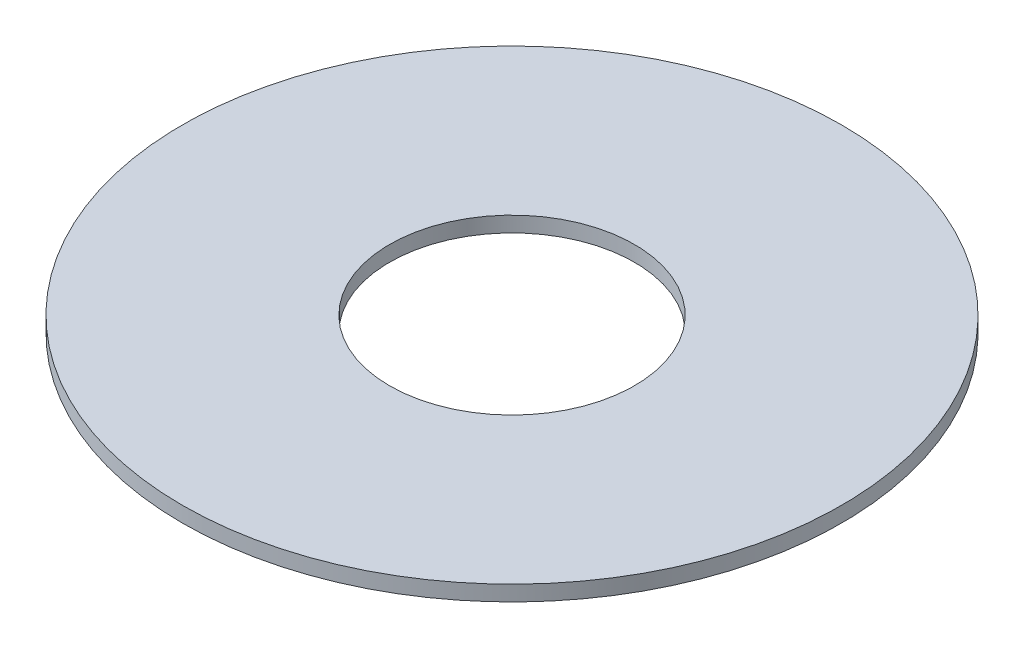
ISO-10303-21;
HEADER;
FILE_DESCRIPTION(('STEP AP214'),'2;1');
FILE_NAME('part.step','',(''),(''),'','','');
FILE_SCHEMA(('AUTOMOTIVE_DESIGN { 1 0 10303 214 1 1 1 1 }'));
ENDSEC;
DATA;
#1=APPLICATION_CONTEXT('core data for automotive mechanical design processes');
#2=APPLICATION_PROTOCOL_DEFINITION('international standard','automotive_design',2000,#1);
#3=PRODUCT_CONTEXT('',#1,'mechanical');
#4=PRODUCT('Part','Part','',(#3));
#5=PRODUCT_RELATED_PRODUCT_CATEGORY('part','',(#4));
#6=PRODUCT_DEFINITION_FORMATION('','',#4);
#7=PRODUCT_DEFINITION_CONTEXT('part definition',#1,'design');
#8=PRODUCT_DEFINITION('design','',#6,#7);
#9=PRODUCT_DEFINITION_SHAPE('','',#8);
#10=(LENGTH_UNIT() NAMED_UNIT(*) SI_UNIT(.MILLI.,.METRE.));
#11=(NAMED_UNIT(*) PLANE_ANGLE_UNIT() SI_UNIT($,.RADIAN.));
#12=(NAMED_UNIT(*) SI_UNIT($,.STERADIAN.) SOLID_ANGLE_UNIT());
#13=UNCERTAINTY_MEASURE_WITH_UNIT(LENGTH_MEASURE(1.E-05),#10,'distance_accuracy_value','');
#14=(GEOMETRIC_REPRESENTATION_CONTEXT(3) GLOBAL_UNCERTAINTY_ASSIGNED_CONTEXT((#13)) GLOBAL_UNIT_ASSIGNED_CONTEXT((#10,
#11,#12)) REPRESENTATION_CONTEXT('',''));
#15=CARTESIAN_POINT('',(0.,0.,0.));
#16=DIRECTION('',(0.,0.,1.));
#17=DIRECTION('',(1.,0.,0.));
#18=AXIS2_PLACEMENT_3D('',#15,#16,#17);
#19=CARTESIAN_POINT('',(0.,2.,0.));
#20=DIRECTION('',(0.,1.,0.));
#21=DIRECTION('',(0.,0.,1.));
#22=AXIS2_PLACEMENT_3D('',#19,#20,#21);
#23=PLANE('',#22);
#24=CARTESIAN_POINT('',(0.,2.,0.));
#25=DIRECTION('',(0.,1.,0.));
#26=DIRECTION('',(0.,0.,1.));
#27=AXIS2_PLACEMENT_3D('',#24,#25,#26);
#28=CIRCLE('',#27,42.725);
#29=CARTESIAN_POINT('',(0.,2.,42.725));
#30=VERTEX_POINT('',#29);
#31=EDGE_CURVE('E10',#30,#30,#28,.T.);
#32=ORIENTED_EDGE('',*,*,#31,.T.);
#33=EDGE_LOOP('',(#32));
#34=FACE_BOUND('',#33,.T.);
#35=CARTESIAN_POINT('',(0.,2.,0.));
#36=DIRECTION('',(0.,1.,0.));
#37=DIRECTION('',(0.,0.,1.));
#38=AXIS2_PLACEMENT_3D('',#35,#36,#37);
#39=CIRCLE('',#38,15.875);
#40=CARTESIAN_POINT('',(0.,2.,15.875));
#41=VERTEX_POINT('',#40);
#42=EDGE_CURVE('E41',#41,#41,#39,.T.);
#43=ORIENTED_EDGE('',*,*,#42,.F.);
#44=EDGE_LOOP('',(#43));
#45=FACE_BOUND('',#44,.T.);
#46=ADVANCED_FACE('F30',(#34,#45),#23,.T.);
#47=CARTESIAN_POINT('',(0.,0.,0.));
#48=DIRECTION('',(0.,1.,0.));
#49=DIRECTION('',(0.,0.,1.));
#50=AXIS2_PLACEMENT_3D('',#47,#48,#49);
#51=PLANE('',#50);
#52=CARTESIAN_POINT('',(0.,0.,0.));
#53=DIRECTION('',(0.,1.,0.));
#54=DIRECTION('',(0.,0.,1.));
#55=AXIS2_PLACEMENT_3D('',#52,#53,#54);
#56=CIRCLE('',#55,42.725);
#57=CARTESIAN_POINT('',(0.,0.,42.725));
#58=VERTEX_POINT('',#57);
#59=EDGE_CURVE('E34',#58,#58,#56,.T.);
#60=ORIENTED_EDGE('',*,*,#59,.F.);
#61=EDGE_LOOP('',(#60));
#62=FACE_BOUND('',#61,.T.);
#63=CARTESIAN_POINT('',(0.,0.,0.));
#64=DIRECTION('',(0.,1.,0.));
#65=DIRECTION('',(0.,0.,1.));
#66=AXIS2_PLACEMENT_3D('',#63,#64,#65);
#67=CIRCLE('',#66,15.875);
#68=CARTESIAN_POINT('',(0.,0.,15.875));
#69=VERTEX_POINT('',#68);
#70=EDGE_CURVE('E43',#69,#69,#67,.T.);
#71=ORIENTED_EDGE('',*,*,#70,.T.);
#72=EDGE_LOOP('',(#71));
#73=FACE_BOUND('',#72,.T.);
#74=ADVANCED_FACE('F53',(#62,#73),#51,.F.);
#75=CARTESIAN_POINT('',(0.,2.,0.));
#76=DIRECTION('',(0.,-1.,0.));
#77=DIRECTION('',(0.,0.,-1.));
#78=AXIS2_PLACEMENT_3D('',#75,#76,#77);
#79=CYLINDRICAL_SURFACE('',#78,42.725);
#80=ORIENTED_EDGE('',*,*,#31,.F.);
#81=EDGE_LOOP('',(#80));
#82=FACE_BOUND('',#81,.T.);
#83=ORIENTED_EDGE('',*,*,#59,.T.);
#84=EDGE_LOOP('',(#83));
#85=FACE_BOUND('',#84,.T.);
#86=ADVANCED_FACE('F32',(#82,#85),#79,.T.);
#87=CARTESIAN_POINT('',(0.,2.,0.));
#88=DIRECTION('',(0.,-1.,0.));
#89=DIRECTION('',(0.,0.,-1.));
#90=AXIS2_PLACEMENT_3D('',#87,#88,#89);
#91=CYLINDRICAL_SURFACE('',#90,15.875);
#92=ORIENTED_EDGE('',*,*,#42,.T.);
#93=EDGE_LOOP('',(#92));
#94=FACE_BOUND('',#93,.T.);
#95=ORIENTED_EDGE('',*,*,#70,.F.);
#96=EDGE_LOOP('',(#95));
#97=FACE_BOUND('',#96,.T.);
#98=ADVANCED_FACE('F49',(#94,#97),#91,.F.);
#99=CLOSED_SHELL('',(#46,#74,#86,#98));
#100=MANIFOLD_SOLID_BREP('B2',#99);
#101=ADVANCED_BREP_SHAPE_REPRESENTATION('',(#18,#100),#14);
#102=SHAPE_DEFINITION_REPRESENTATION(#9,#101);
ENDSEC;
END-ISO-10303-21;
